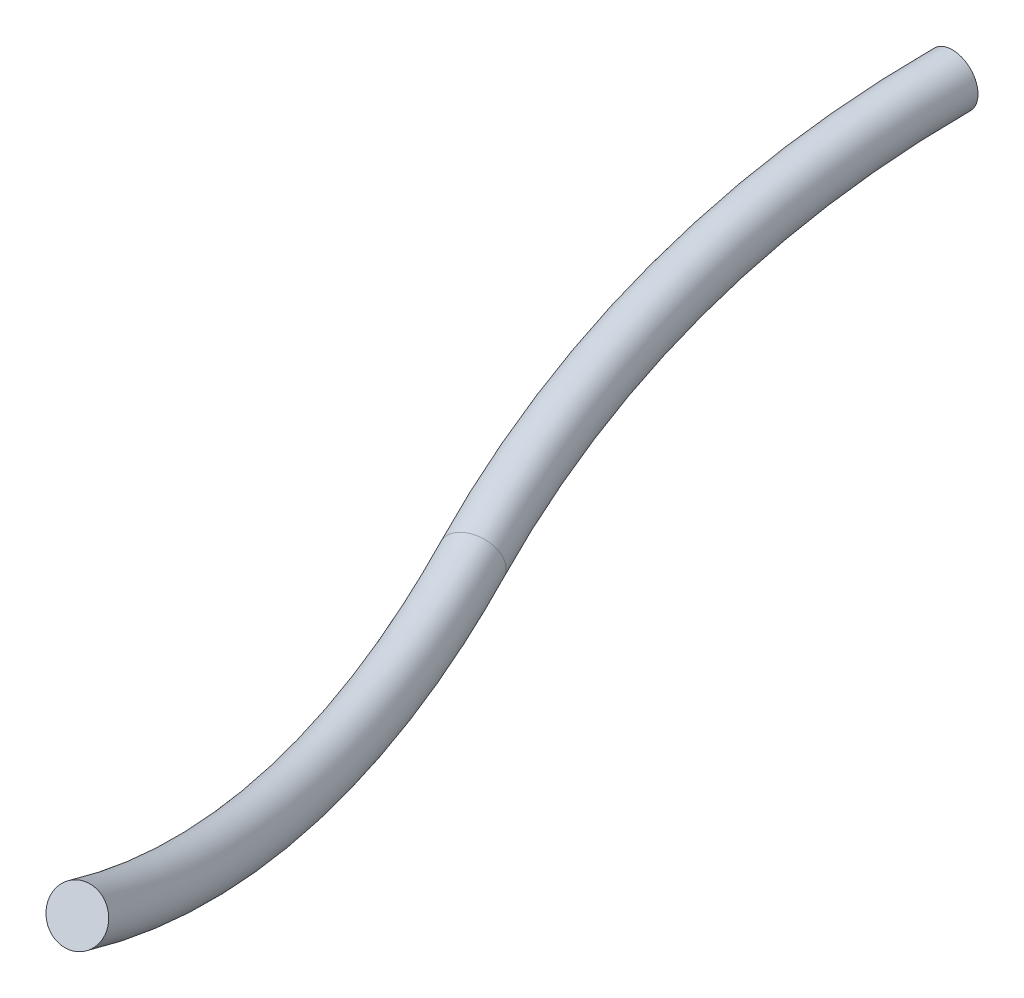
ISO-10303-21;
HEADER;
FILE_DESCRIPTION(('STEP AP214'),'2;1');
FILE_NAME('part.step','',(''),(''),'','','');
FILE_SCHEMA(('AUTOMOTIVE_DESIGN { 1 0 10303 214 1 1 1 1 }'));
ENDSEC;
DATA;
#1=APPLICATION_CONTEXT('core data for automotive mechanical design processes');
#2=APPLICATION_PROTOCOL_DEFINITION('international standard','automotive_design',2000,#1);
#3=PRODUCT_CONTEXT('',#1,'mechanical');
#4=PRODUCT('Part','Part','',(#3));
#5=PRODUCT_RELATED_PRODUCT_CATEGORY('part','',(#4));
#6=PRODUCT_DEFINITION_FORMATION('','',#4);
#7=PRODUCT_DEFINITION_CONTEXT('part definition',#1,'design');
#8=PRODUCT_DEFINITION('design','',#6,#7);
#9=PRODUCT_DEFINITION_SHAPE('','',#8);
#10=(LENGTH_UNIT() NAMED_UNIT(*) SI_UNIT(.MILLI.,.METRE.));
#11=(NAMED_UNIT(*) PLANE_ANGLE_UNIT() SI_UNIT($,.RADIAN.));
#12=(NAMED_UNIT(*) SI_UNIT($,.STERADIAN.) SOLID_ANGLE_UNIT());
#13=UNCERTAINTY_MEASURE_WITH_UNIT(LENGTH_MEASURE(1.E-05),#10,'distance_accuracy_value','');
#14=(GEOMETRIC_REPRESENTATION_CONTEXT(3) GLOBAL_UNCERTAINTY_ASSIGNED_CONTEXT((#13)) GLOBAL_UNIT_ASSIGNED_CONTEXT((#10,
#11,#12)) REPRESENTATION_CONTEXT('',''));
#15=CARTESIAN_POINT('',(0.,0.,0.));
#16=DIRECTION('',(0.,0.,1.));
#17=DIRECTION('',(1.,0.,0.));
#18=AXIS2_PLACEMENT_3D('',#15,#16,#17);
#19=CARTESIAN_POINT('',(4006.87176969766,-14754.3425533988,3.33066907387547E-12));
#20=DIRECTION('',(-0.45214039237946,-0.891946784051015,0.));
#21=DIRECTION('',(0.891946784051015,-0.45214039237946,0.));
#22=AXIS2_PLACEMENT_3D('',#19,#20,#21);
#23=TOROIDAL_SURFACE('',#22,2827.96507144379,50.799999999984);
#24=CARTESIAN_POINT('',(1715.28369888118,-13592.7042717905,1181.78130874533));
#25=DIRECTION('',(0.372736583075562,-0.18894542582523,0.908497146774208));
#26=DIRECTION('',(-0.036901743620048,-0.981293986212859,-0.18894542582523));
#27=AXIS2_PLACEMENT_3D('',#24,#25,#26);
#28=CIRCLE('',#27,50.799999999984);
#29=CARTESIAN_POINT('',(1674.11887857524,-13571.8372443645,1203.01017436693));
#30=VERTEX_POINT('',#29);
#31=EDGE_CURVE('E10',#30,#30,#28,.T.);
#32=CARTESIAN_POINT('',(1484.47741881477,-13475.7053163608,4.98706628930736E-12));
#33=DIRECTION('',(0.,0.,1.));
#34=DIRECTION('',(0.,-1.,0.));
#35=AXIS2_PLACEMENT_3D('',#32,#33,#34);
#36=CIRCLE('',#35,50.799999999984);
#37=CARTESIAN_POINT('',(1439.16652218499,-13452.736584428,5.01682089250016E-12));
#38=VERTEX_POINT('',#37);
#39=EDGE_CURVE('E41',#38,#38,#36,.T.);
#40=CARTESIAN_POINT('',(4006.87176969766,-14754.3425533988,3.33066907387547E-12));
#41=DIRECTION('',(-0.45214039237946,-0.891946784051015,0.));
#42=DIRECTION('',(0.891946784051015,-0.45214039237946,0.));
#43=AXIS2_PLACEMENT_3D('',#40,#41,#42);
#44=CIRCLE('',#43,2878.76507144378);
#45=EDGE_CURVE('',#30,#38,#44,.T.);
#46=ORIENTED_EDGE('',*,*,#31,.F.);
#47=ORIENTED_EDGE('',*,*,#39,.T.);
#48=ORIENTED_EDGE('',*,*,#45,.T.);
#49=ORIENTED_EDGE('',*,*,#45,.F.);
#50=EDGE_LOOP('',(#46,#48,#47,#49));
#51=FACE_BOUND('',#50,.T.);
#52=ADVANCED_FACE('F35',(#51),#23,.T.);
#53=CARTESIAN_POINT('',(1484.47741881477,-13475.7053163608,4.98706628930736E-12));
#54=DIRECTION('',(0.,0.,1.));
#55=DIRECTION('',(0.,-1.,0.));
#56=AXIS2_PLACEMENT_3D('',#53,#54,#55);
#57=PLANE('',#56);
#58=ORIENTED_EDGE('',*,*,#39,.F.);
#59=EDGE_LOOP('',(#58));
#60=FACE_BOUND('',#59,.T.);
#61=ADVANCED_FACE('F56',(#60),#57,.F.);
#62=CARTESIAN_POINT('',(1343.73597724483,-11763.016313261,1714.75006971848));
#63=DIRECTION('',(0.907991555118267,0.276165730177602,-0.315093359671993));
#64=DIRECTION('',(-0.327843170798713,0.,-0.944732160646945));
#65=AXIS2_PLACEMENT_3D('',#62,#63,#64);
#66=TOROIDAL_SURFACE('',#65,1941.61310131924,50.799999993203);
#67=CARTESIAN_POINT('',(2069.56846030902,-13459.2004780411,2319.71942505195));
#68=DIRECTION('',(0.189216153878774,0.400703961498434,0.896456124052252));
#69=DIRECTION('',(0.976477626905129,0.01933724944261,-0.214749889261258));
#70=AXIS2_PLACEMENT_3D('',#67,#68,#69);
#71=CIRCLE('',#70,50.799999993203);
#72=CARTESIAN_POINT('',(2119.17352374916,-13458.2181457695,2308.81013067894));
#73=VERTEX_POINT('',#72);
#74=EDGE_CURVE('E45',#73,#73,#71,.T.);
#75=ORIENTED_EDGE('',*,*,#74,.F.);
#76=EDGE_LOOP('',(#75));
#77=FACE_BOUND('',#76,.T.);
#78=ORIENTED_EDGE('',*,*,#31,.T.);
#79=EDGE_LOOP('',(#78));
#80=FACE_BOUND('',#79,.T.);
#81=ADVANCED_FACE('F54',(#77,#80),#66,.T.);
#82=CARTESIAN_POINT('',(2069.56846030902,-13459.2004780411,2319.71942505195));
#83=DIRECTION('',(0.189216153878774,0.400703961498434,0.896456124052252));
#84=DIRECTION('',(0.976477626905129,0.01933724944261,-0.214749889261258));
#85=AXIS2_PLACEMENT_3D('',#82,#83,#84);
#86=PLANE('',#85);
#87=ORIENTED_EDGE('',*,*,#74,.T.);
#88=EDGE_LOOP('',(#87));
#89=FACE_BOUND('',#88,.T.);
#90=ADVANCED_FACE('F52',(#89),#86,.T.);
#91=CLOSED_SHELL('',(#52,#61,#81,#90));
#92=MANIFOLD_SOLID_BREP('B2',#91);
#93=ADVANCED_BREP_SHAPE_REPRESENTATION('',(#18,#92),#14);
#94=SHAPE_DEFINITION_REPRESENTATION(#9,#93);
ENDSEC;
END-ISO-10303-21;
